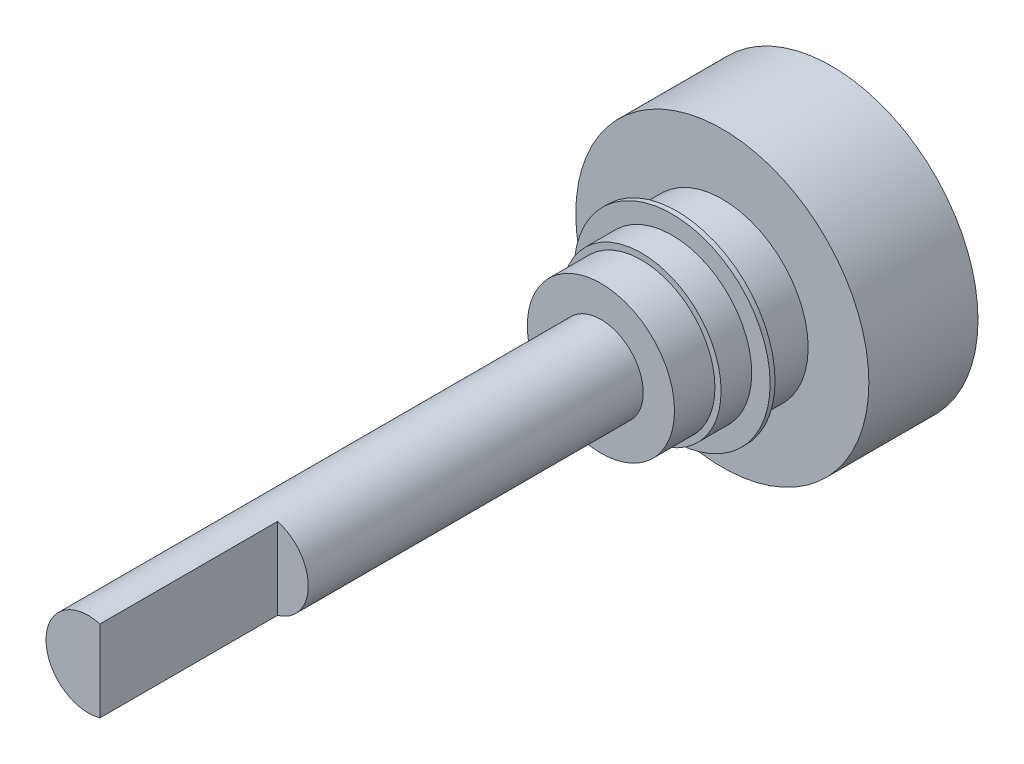
ISO-10303-21;
HEADER;
FILE_DESCRIPTION(('STEP AP214'),'2;1');
FILE_NAME('part.step','',(''),(''),'','','');
FILE_SCHEMA(('AUTOMOTIVE_DESIGN { 1 0 10303 214 1 1 1 1 }'));
ENDSEC;
DATA;
#1=APPLICATION_CONTEXT('core data for automotive mechanical design processes');
#2=APPLICATION_PROTOCOL_DEFINITION('international standard','automotive_design',2000,#1);
#3=PRODUCT_CONTEXT('',#1,'mechanical');
#4=PRODUCT('Part','Part','',(#3));
#5=PRODUCT_RELATED_PRODUCT_CATEGORY('part','',(#4));
#6=PRODUCT_DEFINITION_FORMATION('','',#4);
#7=PRODUCT_DEFINITION_CONTEXT('part definition',#1,'design');
#8=PRODUCT_DEFINITION('design','',#6,#7);
#9=PRODUCT_DEFINITION_SHAPE('','',#8);
#10=(LENGTH_UNIT() NAMED_UNIT(*) SI_UNIT(.MILLI.,.METRE.));
#11=(NAMED_UNIT(*) PLANE_ANGLE_UNIT() SI_UNIT($,.RADIAN.));
#12=(NAMED_UNIT(*) SI_UNIT($,.STERADIAN.) SOLID_ANGLE_UNIT());
#13=UNCERTAINTY_MEASURE_WITH_UNIT(LENGTH_MEASURE(1.E-05),#10,'distance_accuracy_value','');
#14=(GEOMETRIC_REPRESENTATION_CONTEXT(3) GLOBAL_UNCERTAINTY_ASSIGNED_CONTEXT((#13)) GLOBAL_UNIT_ASSIGNED_CONTEXT((#10,
#11,#12)) REPRESENTATION_CONTEXT('',''));
#15=CARTESIAN_POINT('',(0.,0.,0.));
#16=DIRECTION('',(0.,0.,1.));
#17=DIRECTION('',(1.,0.,0.));
#18=AXIS2_PLACEMENT_3D('',#15,#16,#17);
#19=CARTESIAN_POINT('',(0.,0.,8.9));
#20=DIRECTION('',(0.,0.,-1.));
#21=DIRECTION('',(-1.,0.,0.));
#22=AXIS2_PLACEMENT_3D('',#19,#20,#21);
#23=CYLINDRICAL_SURFACE('',#22,11.95);
#24=CARTESIAN_POINT('',(0.,0.,8.9));
#25=DIRECTION('',(0.,0.,1.));
#26=DIRECTION('',(1.,0.,0.));
#27=AXIS2_PLACEMENT_3D('',#24,#25,#26);
#28=CIRCLE('',#27,11.95);
#29=CARTESIAN_POINT('',(11.95,0.,8.9));
#30=VERTEX_POINT('',#29);
#31=EDGE_CURVE('E122',#30,#30,#28,.T.);
#32=ORIENTED_EDGE('',*,*,#31,.F.);
#33=EDGE_LOOP('',(#32));
#34=FACE_BOUND('',#33,.T.);
#35=CARTESIAN_POINT('',(0.,0.,0.));
#36=DIRECTION('',(0.,0.,1.));
#37=DIRECTION('',(1.,0.,0.));
#38=AXIS2_PLACEMENT_3D('',#35,#36,#37);
#39=CIRCLE('',#38,11.95);
#40=CARTESIAN_POINT('',(11.95,0.,0.));
#41=VERTEX_POINT('',#40);
#42=EDGE_CURVE('E46',#41,#41,#39,.T.);
#43=ORIENTED_EDGE('',*,*,#42,.T.);
#44=EDGE_LOOP('',(#43));
#45=FACE_BOUND('',#44,.T.);
#46=ADVANCED_FACE('F43',(#34,#45),#23,.T.);
#47=CARTESIAN_POINT('',(0.,0.,8.9));
#48=DIRECTION('',(0.,0.,1.));
#49=DIRECTION('',(1.,0.,0.));
#50=AXIS2_PLACEMENT_3D('',#47,#48,#49);
#51=PLANE('',#50);
#52=CARTESIAN_POINT('',(0.,0.,8.9));
#53=DIRECTION('',(0.,0.,1.));
#54=DIRECTION('',(1.,0.,0.));
#55=AXIS2_PLACEMENT_3D('',#52,#53,#54);
#56=CIRCLE('',#55,7.);
#57=CARTESIAN_POINT('',(7.,0.,8.9));
#58=VERTEX_POINT('',#57);
#59=EDGE_CURVE('E108',#58,#58,#56,.T.);
#60=ORIENTED_EDGE('',*,*,#59,.F.);
#61=EDGE_LOOP('',(#60));
#62=FACE_BOUND('',#61,.T.);
#63=ORIENTED_EDGE('',*,*,#31,.T.);
#64=EDGE_LOOP('',(#63));
#65=FACE_BOUND('',#64,.T.);
#66=ADVANCED_FACE('F137',(#62,#65),#51,.T.);
#67=CARTESIAN_POINT('',(0.,0.,0.));
#68=DIRECTION('',(0.,0.,1.));
#69=DIRECTION('',(1.,0.,0.));
#70=AXIS2_PLACEMENT_3D('',#67,#68,#69);
#71=PLANE('',#70);
#72=ORIENTED_EDGE('',*,*,#42,.F.);
#73=EDGE_LOOP('',(#72));
#74=FACE_BOUND('',#73,.T.);
#75=ADVANCED_FACE('F134',(#74),#71,.F.);
#76=CARTESIAN_POINT('',(0.,0.,12.6));
#77=DIRECTION('',(0.,0.,-1.));
#78=DIRECTION('',(-1.,0.,0.));
#79=AXIS2_PLACEMENT_3D('',#76,#77,#78);
#80=CYLINDRICAL_SURFACE('',#79,7.);
#81=CARTESIAN_POINT('',(0.,0.,12.6));
#82=DIRECTION('',(0.,0.,1.));
#83=DIRECTION('',(1.,0.,0.));
#84=AXIS2_PLACEMENT_3D('',#81,#82,#83);
#85=CIRCLE('',#84,7.);
#86=CARTESIAN_POINT('',(7.,0.,12.6));
#87=VERTEX_POINT('',#86);
#88=EDGE_CURVE('E113',#87,#87,#85,.T.);
#89=ORIENTED_EDGE('',*,*,#88,.F.);
#90=EDGE_LOOP('',(#89));
#91=FACE_BOUND('',#90,.T.);
#92=ORIENTED_EDGE('',*,*,#59,.T.);
#93=EDGE_LOOP('',(#92));
#94=FACE_BOUND('',#93,.T.);
#95=ADVANCED_FACE('F136',(#91,#94),#80,.T.);
#96=CARTESIAN_POINT('',(0.,0.,13.));
#97=DIRECTION('',(0.,0.,-1.));
#98=DIRECTION('',(-1.,0.,0.));
#99=AXIS2_PLACEMENT_3D('',#96,#97,#98);
#100=CYLINDRICAL_SURFACE('',#99,8.);
#101=CARTESIAN_POINT('',(0.,0.,13.));
#102=DIRECTION('',(0.,0.,1.));
#103=DIRECTION('',(1.,0.,0.));
#104=AXIS2_PLACEMENT_3D('',#101,#102,#103);
#105=CIRCLE('',#104,8.);
#106=CARTESIAN_POINT('',(8.,0.,13.));
#107=VERTEX_POINT('',#106);
#108=EDGE_CURVE('E109',#107,#107,#105,.T.);
#109=ORIENTED_EDGE('',*,*,#108,.F.);
#110=EDGE_LOOP('',(#109));
#111=FACE_BOUND('',#110,.T.);
#112=CARTESIAN_POINT('',(0.,0.,12.6));
#113=DIRECTION('',(0.,0.,1.));
#114=DIRECTION('',(1.,0.,0.));
#115=AXIS2_PLACEMENT_3D('',#112,#113,#114);
#116=CIRCLE('',#115,8.);
#117=CARTESIAN_POINT('',(8.,0.,12.6));
#118=VERTEX_POINT('',#117);
#119=EDGE_CURVE('E104',#118,#118,#116,.T.);
#120=ORIENTED_EDGE('',*,*,#119,.T.);
#121=EDGE_LOOP('',(#120));
#122=FACE_BOUND('',#121,.T.);
#123=ADVANCED_FACE('F143',(#111,#122),#100,.T.);
#124=CARTESIAN_POINT('',(0.,0.,13.));
#125=DIRECTION('',(0.,0.,1.));
#126=DIRECTION('',(1.,0.,0.));
#127=AXIS2_PLACEMENT_3D('',#124,#125,#126);
#128=PLANE('',#127);
#129=CARTESIAN_POINT('',(0.,0.,13.));
#130=DIRECTION('',(0.,0.,1.));
#131=DIRECTION('',(1.,0.,0.));
#132=AXIS2_PLACEMENT_3D('',#129,#130,#131);
#133=CIRCLE('',#132,6.5);
#134=CARTESIAN_POINT('',(6.5,0.,13.));
#135=VERTEX_POINT('',#134);
#136=EDGE_CURVE('E100',#135,#135,#133,.T.);
#137=ORIENTED_EDGE('',*,*,#136,.F.);
#138=EDGE_LOOP('',(#137));
#139=FACE_BOUND('',#138,.T.);
#140=ORIENTED_EDGE('',*,*,#108,.T.);
#141=EDGE_LOOP('',(#140));
#142=FACE_BOUND('',#141,.T.);
#143=ADVANCED_FACE('F177',(#139,#142),#128,.T.);
#144=CARTESIAN_POINT('',(0.,0.,12.6));
#145=DIRECTION('',(0.,0.,1.));
#146=DIRECTION('',(1.,0.,0.));
#147=AXIS2_PLACEMENT_3D('',#144,#145,#146);
#148=PLANE('',#147);
#149=ORIENTED_EDGE('',*,*,#88,.T.);
#150=EDGE_LOOP('',(#149));
#151=FACE_BOUND('',#150,.T.);
#152=ORIENTED_EDGE('',*,*,#119,.F.);
#153=EDGE_LOOP('',(#152));
#154=FACE_BOUND('',#153,.T.);
#155=ADVANCED_FACE('F188',(#151,#154),#148,.F.);
#156=CARTESIAN_POINT('',(0.,0.,15.5));
#157=DIRECTION('',(0.,0.,-1.));
#158=DIRECTION('',(-1.,0.,0.));
#159=AXIS2_PLACEMENT_3D('',#156,#157,#158);
#160=CYLINDRICAL_SURFACE('',#159,6.5);
#161=CARTESIAN_POINT('',(0.,0.,15.5));
#162=DIRECTION('',(0.,0.,1.));
#163=DIRECTION('',(1.,0.,0.));
#164=AXIS2_PLACEMENT_3D('',#161,#162,#163);
#165=CIRCLE('',#164,6.5);
#166=CARTESIAN_POINT('',(6.5,0.,15.5));
#167=VERTEX_POINT('',#166);
#168=EDGE_CURVE('E93',#167,#167,#165,.T.);
#169=ORIENTED_EDGE('',*,*,#168,.F.);
#170=EDGE_LOOP('',(#169));
#171=FACE_BOUND('',#170,.T.);
#172=ORIENTED_EDGE('',*,*,#136,.T.);
#173=EDGE_LOOP('',(#172));
#174=FACE_BOUND('',#173,.T.);
#175=ADVANCED_FACE('F198',(#171,#174),#160,.T.);
#176=CARTESIAN_POINT('',(0.,0.,15.5));
#177=DIRECTION('',(0.,0.,1.));
#178=DIRECTION('',(1.,0.,0.));
#179=AXIS2_PLACEMENT_3D('',#176,#177,#178);
#180=PLANE('',#179);
#181=CARTESIAN_POINT('',(0.,0.,15.5));
#182=DIRECTION('',(0.,0.,1.));
#183=DIRECTION('',(1.,0.,0.));
#184=AXIS2_PLACEMENT_3D('',#181,#182,#183);
#185=CIRCLE('',#184,6.);
#186=CARTESIAN_POINT('',(6.,0.,15.5));
#187=VERTEX_POINT('',#186);
#188=EDGE_CURVE('E52',#187,#187,#185,.T.);
#189=ORIENTED_EDGE('',*,*,#188,.F.);
#190=EDGE_LOOP('',(#189));
#191=FACE_BOUND('',#190,.T.);
#192=ORIENTED_EDGE('',*,*,#168,.T.);
#193=EDGE_LOOP('',(#192));
#194=FACE_BOUND('',#193,.T.);
#195=ADVANCED_FACE('F207',(#191,#194),#180,.T.);
#196=CARTESIAN_POINT('',(0.,0.,18.8));
#197=DIRECTION('',(0.,0.,-1.));
#198=DIRECTION('',(-1.,0.,0.));
#199=AXIS2_PLACEMENT_3D('',#196,#197,#198);
#200=CYLINDRICAL_SURFACE('',#199,6.);
#201=CARTESIAN_POINT('',(0.,0.,18.8));
#202=DIRECTION('',(0.,0.,1.));
#203=DIRECTION('',(1.,0.,0.));
#204=AXIS2_PLACEMENT_3D('',#201,#202,#203);
#205=CIRCLE('',#204,6.);
#206=CARTESIAN_POINT('',(6.,0.,18.8));
#207=VERTEX_POINT('',#206);
#208=EDGE_CURVE('E88',#207,#207,#205,.T.);
#209=ORIENTED_EDGE('',*,*,#208,.F.);
#210=EDGE_LOOP('',(#209));
#211=FACE_BOUND('',#210,.T.);
#212=ORIENTED_EDGE('',*,*,#188,.T.);
#213=EDGE_LOOP('',(#212));
#214=FACE_BOUND('',#213,.T.);
#215=ADVANCED_FACE('F217',(#211,#214),#200,.T.);
#216=CARTESIAN_POINT('',(0.,0.,18.8));
#217=DIRECTION('',(0.,0.,1.));
#218=DIRECTION('',(1.,0.,0.));
#219=AXIS2_PLACEMENT_3D('',#216,#217,#218);
#220=PLANE('',#219);
#221=CARTESIAN_POINT('',(0.,0.,18.8));
#222=DIRECTION('',(0.,0.,1.));
#223=DIRECTION('',(1.,0.,0.));
#224=AXIS2_PLACEMENT_3D('',#221,#222,#223);
#225=CIRCLE('',#224,3.45);
#226=CARTESIAN_POINT('',(3.45,0.,18.8));
#227=VERTEX_POINT('',#226);
#228=EDGE_CURVE('E11',#227,#227,#225,.T.);
#229=ORIENTED_EDGE('',*,*,#228,.F.);
#230=EDGE_LOOP('',(#229));
#231=FACE_BOUND('',#230,.T.);
#232=ORIENTED_EDGE('',*,*,#208,.T.);
#233=EDGE_LOOP('',(#232));
#234=FACE_BOUND('',#233,.T.);
#235=ADVANCED_FACE('F227',(#231,#234),#220,.T.);
#236=CARTESIAN_POINT('',(0.,0.,60.6));
#237=DIRECTION('',(0.,0.,-1.));
#238=DIRECTION('',(-1.,0.,0.));
#239=AXIS2_PLACEMENT_3D('',#236,#237,#238);
#240=CYLINDRICAL_SURFACE('',#239,3.45);
#241=CARTESIAN_POINT('',(0.,0.,60.6));
#242=DIRECTION('',(0.,0.,1.));
#243=DIRECTION('',(1.,0.,0.));
#244=AXIS2_PLACEMENT_3D('',#241,#242,#243);
#245=CIRCLE('',#244,3.45);
#246=CARTESIAN_POINT('',(0.95,3.3166247903554,60.6));
#247=VERTEX_POINT('',#246);
#248=CARTESIAN_POINT('',(0.95,-3.3166247903554,60.6));
#249=VERTEX_POINT('',#248);
#250=EDGE_CURVE('E83',#247,#249,#245,.T.);
#251=ORIENTED_EDGE('',*,*,#250,.F.);
#252=DIRECTION('',(0.,0.,1.));
#253=VECTOR('',#252,1.);
#254=CARTESIAN_POINT('',(0.95,3.3166247903554,46.11));
#255=LINE('',#254,#253);
#256=CARTESIAN_POINT('',(0.95,3.3166247903554,46.11));
#257=VERTEX_POINT('',#256);
#258=EDGE_CURVE('E60',#257,#247,#255,.T.);
#259=ORIENTED_EDGE('',*,*,#258,.F.);
#260=CARTESIAN_POINT('',(0.,0.,46.11));
#261=DIRECTION('',(0.,0.,1.));
#262=DIRECTION('',(1.,0.,0.));
#263=AXIS2_PLACEMENT_3D('',#260,#261,#262);
#264=CIRCLE('',#263,3.45);
#265=CARTESIAN_POINT('',(0.95,-3.3166247903554,46.11));
#266=VERTEX_POINT('',#265);
#267=EDGE_CURVE('E77',#266,#257,#264,.T.);
#268=ORIENTED_EDGE('',*,*,#267,.F.);
#269=DIRECTION('',(0.,0.,1.));
#270=VECTOR('',#269,1.);
#271=CARTESIAN_POINT('',(0.95,-3.3166247903554,46.11));
#272=LINE('',#271,#270);
#273=EDGE_CURVE('E66',#266,#249,#272,.T.);
#274=ORIENTED_EDGE('',*,*,#273,.T.);
#275=EDGE_LOOP('',(#251,#259,#268,#274));
#276=FACE_BOUND('',#275,.T.);
#277=ORIENTED_EDGE('',*,*,#228,.T.);
#278=EDGE_LOOP('',(#277));
#279=FACE_BOUND('',#278,.T.);
#280=ADVANCED_FACE('F81',(#276,#279),#240,.T.);
#281=CARTESIAN_POINT('',(0.,0.,60.6));
#282=DIRECTION('',(0.,0.,1.));
#283=DIRECTION('',(1.,0.,0.));
#284=AXIS2_PLACEMENT_3D('',#281,#282,#283);
#285=PLANE('',#284);
#286=DIRECTION('',(0.,-1.,0.));
#287=VECTOR('',#286,1.);
#288=CARTESIAN_POINT('',(0.95,3.3166247903554,60.6));
#289=LINE('',#288,#287);
#290=EDGE_CURVE('E71',#247,#249,#289,.T.);
#291=ORIENTED_EDGE('',*,*,#290,.F.);
#292=ORIENTED_EDGE('',*,*,#250,.T.);
#293=EDGE_LOOP('',(#291,#292));
#294=FACE_BOUND('',#293,.T.);
#295=ADVANCED_FACE('F86',(#294),#285,.T.);
#296=CARTESIAN_POINT('',(0.95,3.3166247903554,46.11));
#297=DIRECTION('',(-1.,0.,0.));
#298=DIRECTION('',(0.,-1.,0.));
#299=AXIS2_PLACEMENT_3D('',#296,#297,#298);
#300=PLANE('',#299);
#301=ORIENTED_EDGE('',*,*,#290,.T.);
#302=ORIENTED_EDGE('',*,*,#273,.F.);
#303=DIRECTION('',(0.,-1.,0.));
#304=VECTOR('',#303,1.);
#305=CARTESIAN_POINT('',(0.95,3.3166247903554,46.11));
#306=LINE('',#305,#304);
#307=EDGE_CURVE('E274',#257,#266,#306,.T.);
#308=ORIENTED_EDGE('',*,*,#307,.F.);
#309=ORIENTED_EDGE('',*,*,#258,.T.);
#310=EDGE_LOOP('',(#301,#302,#308,#309));
#311=FACE_BOUND('',#310,.T.);
#312=ADVANCED_FACE('F72',(#311),#300,.F.);
#313=CARTESIAN_POINT('',(0.,0.,46.11));
#314=DIRECTION('',(0.,0.,1.));
#315=DIRECTION('',(1.,0.,0.));
#316=AXIS2_PLACEMENT_3D('',#313,#314,#315);
#317=PLANE('',#316);
#318=ORIENTED_EDGE('',*,*,#267,.T.);
#319=ORIENTED_EDGE('',*,*,#307,.T.);
#320=EDGE_LOOP('',(#318,#319));
#321=FACE_BOUND('',#320,.T.);
#322=ADVANCED_FACE('F262',(#321),#317,.T.);
#323=CLOSED_SHELL('',(#46,#66,#75,#95,#123,#143,#155,#175,#195,#215,#235,#280,#295,#312,#322));
#324=MANIFOLD_SOLID_BREP('B2',#323);
#325=ADVANCED_BREP_SHAPE_REPRESENTATION('',(#18,#324),#14);
#326=SHAPE_DEFINITION_REPRESENTATION(#9,#325);
ENDSEC;
END-ISO-10303-21;
